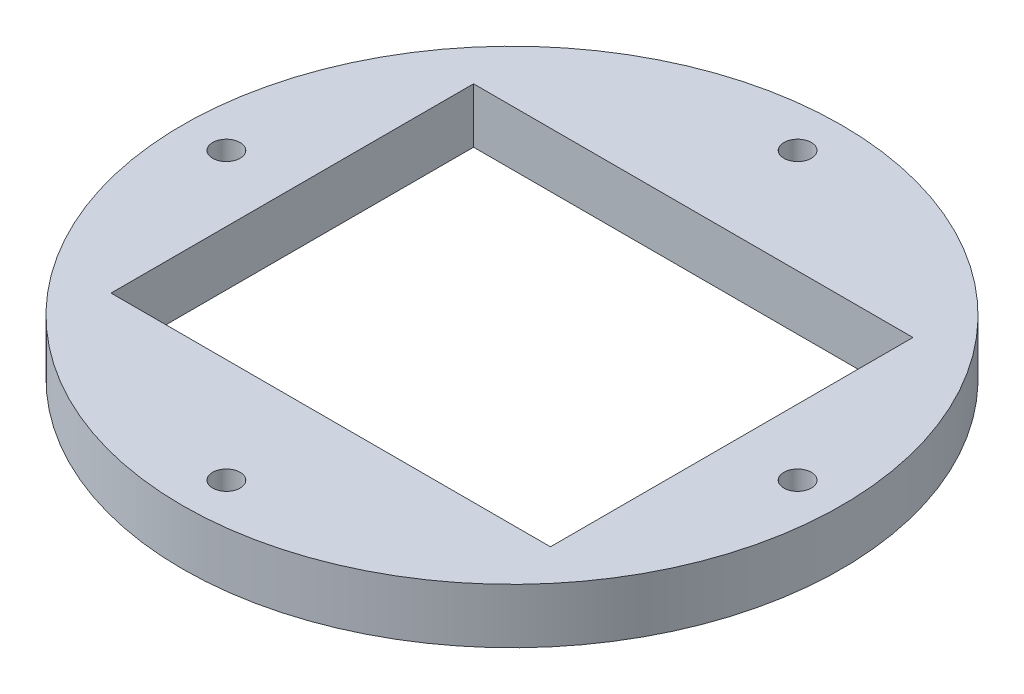
ISO-10303-21;
HEADER;
FILE_DESCRIPTION(('STEP AP214'),'2;1');
FILE_NAME('part.step','',(''),(''),'','','');
FILE_SCHEMA(('AUTOMOTIVE_DESIGN { 1 0 10303 214 1 1 1 1 }'));
ENDSEC;
DATA;
#1=APPLICATION_CONTEXT('core data for automotive mechanical design processes');
#2=APPLICATION_PROTOCOL_DEFINITION('international standard','automotive_design',2000,#1);
#3=PRODUCT_CONTEXT('',#1,'mechanical');
#4=PRODUCT('Part','Part','',(#3));
#5=PRODUCT_RELATED_PRODUCT_CATEGORY('part','',(#4));
#6=PRODUCT_DEFINITION_FORMATION('','',#4);
#7=PRODUCT_DEFINITION_CONTEXT('part definition',#1,'design');
#8=PRODUCT_DEFINITION('design','',#6,#7);
#9=PRODUCT_DEFINITION_SHAPE('','',#8);
#10=(LENGTH_UNIT() NAMED_UNIT(*) SI_UNIT(.MILLI.,.METRE.));
#11=(NAMED_UNIT(*) PLANE_ANGLE_UNIT() SI_UNIT($,.RADIAN.));
#12=(NAMED_UNIT(*) SI_UNIT($,.STERADIAN.) SOLID_ANGLE_UNIT());
#13=UNCERTAINTY_MEASURE_WITH_UNIT(LENGTH_MEASURE(1.E-05),#10,'distance_accuracy_value','');
#14=(GEOMETRIC_REPRESENTATION_CONTEXT(3) GLOBAL_UNCERTAINTY_ASSIGNED_CONTEXT((#13)) GLOBAL_UNIT_ASSIGNED_CONTEXT((#10,
#11,#12)) REPRESENTATION_CONTEXT('',''));
#15=CARTESIAN_POINT('',(0.,0.,0.));
#16=DIRECTION('',(0.,0.,1.));
#17=DIRECTION('',(1.,0.,0.));
#18=AXIS2_PLACEMENT_3D('',#15,#16,#17);
#19=CARTESIAN_POINT('',(0.,6.35,0.));
#20=DIRECTION('',(0.,1.,0.));
#21=DIRECTION('',(0.,0.,1.));
#22=AXIS2_PLACEMENT_3D('',#19,#20,#21);
#23=PLANE('',#22);
#24=CARTESIAN_POINT('',(0.,6.35,33.02));
#25=DIRECTION('',(0.,1.,0.));
#26=DIRECTION('',(0.,0.,1.));
#27=AXIS2_PLACEMENT_3D('',#24,#25,#26);
#28=CIRCLE('',#27,1.5875);
#29=CARTESIAN_POINT('',(0.,6.35,34.6075));
#30=VERTEX_POINT('',#29);
#31=EDGE_CURVE('E141',#30,#30,#28,.T.);
#32=ORIENTED_EDGE('',*,*,#31,.F.);
#33=EDGE_LOOP('',(#32));
#34=FACE_BOUND('',#33,.T.);
#35=DIRECTION('',(-1.,0.,0.));
#36=VECTOR('',#35,1.);
#37=CARTESIAN_POINT('',(-25.4,6.35,-20.955));
#38=LINE('',#37,#36);
#39=CARTESIAN_POINT('',(25.4,6.35,-20.955));
#40=VERTEX_POINT('',#39);
#41=CARTESIAN_POINT('',(-25.4,6.35,-20.955));
#42=VERTEX_POINT('',#41);
#43=EDGE_CURVE('E82',#40,#42,#38,.T.);
#44=ORIENTED_EDGE('',*,*,#43,.F.);
#45=DIRECTION('',(0.,0.,-1.));
#46=VECTOR('',#45,1.);
#47=CARTESIAN_POINT('',(25.4,6.35,20.955));
#48=LINE('',#47,#46);
#49=CARTESIAN_POINT('',(25.4,6.35,20.955));
#50=VERTEX_POINT('',#49);
#51=EDGE_CURVE('E74',#50,#40,#48,.T.);
#52=ORIENTED_EDGE('',*,*,#51,.F.);
#53=DIRECTION('',(1.,0.,0.));
#54=VECTOR('',#53,1.);
#55=CARTESIAN_POINT('',(-25.4,6.35,20.955));
#56=LINE('',#55,#54);
#57=CARTESIAN_POINT('',(-25.4,6.35,20.955));
#58=VERTEX_POINT('',#57);
#59=EDGE_CURVE('E97',#58,#50,#56,.T.);
#60=ORIENTED_EDGE('',*,*,#59,.F.);
#61=DIRECTION('',(0.,0.,1.));
#62=VECTOR('',#61,1.);
#63=CARTESIAN_POINT('',(-25.4,6.35,20.955));
#64=LINE('',#63,#62);
#65=EDGE_CURVE('E95',#42,#58,#64,.T.);
#66=ORIENTED_EDGE('',*,*,#65,.F.);
#67=EDGE_LOOP('',(#44,#52,#60,#66));
#68=FACE_BOUND('',#67,.T.);
#69=CARTESIAN_POINT('',(0.,6.35,0.));
#70=DIRECTION('',(0.,1.,0.));
#71=DIRECTION('',(0.,0.,1.));
#72=AXIS2_PLACEMENT_3D('',#69,#70,#71);
#73=CIRCLE('',#72,38.1);
#74=CARTESIAN_POINT('',(0.,6.35,38.1));
#75=VERTEX_POINT('',#74);
#76=EDGE_CURVE('E11',#75,#75,#73,.T.);
#77=ORIENTED_EDGE('',*,*,#76,.T.);
#78=EDGE_LOOP('',(#77));
#79=FACE_BOUND('',#78,.T.);
#80=CARTESIAN_POINT('',(0.,6.35,-33.02));
#81=DIRECTION('',(0.,1.,0.));
#82=DIRECTION('',(0.,0.,1.));
#83=AXIS2_PLACEMENT_3D('',#80,#81,#82);
#84=CIRCLE('',#83,1.5875);
#85=CARTESIAN_POINT('',(0.,6.35,-31.4325));
#86=VERTEX_POINT('',#85);
#87=EDGE_CURVE('E113',#86,#86,#84,.T.);
#88=ORIENTED_EDGE('',*,*,#87,.F.);
#89=EDGE_LOOP('',(#88));
#90=FACE_BOUND('',#89,.T.);
#91=CARTESIAN_POINT('',(33.02,6.35,0.));
#92=DIRECTION('',(0.,1.,0.));
#93=DIRECTION('',(0.,0.,1.));
#94=AXIS2_PLACEMENT_3D('',#91,#92,#93);
#95=CIRCLE('',#94,1.5875);
#96=CARTESIAN_POINT('',(33.02,6.35,1.5875));
#97=VERTEX_POINT('',#96);
#98=EDGE_CURVE('E103',#97,#97,#95,.T.);
#99=ORIENTED_EDGE('',*,*,#98,.F.);
#100=EDGE_LOOP('',(#99));
#101=FACE_BOUND('',#100,.T.);
#102=CARTESIAN_POINT('',(-33.02,6.35,0.));
#103=DIRECTION('',(0.,1.,0.));
#104=DIRECTION('',(0.,0.,1.));
#105=AXIS2_PLACEMENT_3D('',#102,#103,#104);
#106=CIRCLE('',#105,1.5875);
#107=CARTESIAN_POINT('',(-33.02,6.35,1.58750000000001));
#108=VERTEX_POINT('',#107);
#109=EDGE_CURVE('E148',#108,#108,#106,.T.);
#110=ORIENTED_EDGE('',*,*,#109,.F.);
#111=EDGE_LOOP('',(#110));
#112=FACE_BOUND('',#111,.T.);
#113=ADVANCED_FACE('F33',(#34,#68,#79,#90,#101,#112),#23,.T.);
#114=CARTESIAN_POINT('',(0.,0.,0.));
#115=DIRECTION('',(0.,1.,0.));
#116=DIRECTION('',(0.,0.,1.));
#117=AXIS2_PLACEMENT_3D('',#114,#115,#116);
#118=PLANE('',#117);
#119=CARTESIAN_POINT('',(0.,0.,33.02));
#120=DIRECTION('',(0.,1.,0.));
#121=DIRECTION('',(0.,0.,1.));
#122=AXIS2_PLACEMENT_3D('',#119,#120,#121);
#123=CIRCLE('',#122,1.5875);
#124=CARTESIAN_POINT('',(0.,0.,34.6075));
#125=VERTEX_POINT('',#124);
#126=EDGE_CURVE('E144',#125,#125,#123,.T.);
#127=ORIENTED_EDGE('',*,*,#126,.T.);
#128=EDGE_LOOP('',(#127));
#129=FACE_BOUND('',#128,.T.);
#130=DIRECTION('',(0.,0.,-1.));
#131=VECTOR('',#130,1.);
#132=CARTESIAN_POINT('',(25.4,0.,20.955));
#133=LINE('',#132,#131);
#134=CARTESIAN_POINT('',(25.4,0.,20.955));
#135=VERTEX_POINT('',#134);
#136=CARTESIAN_POINT('',(25.4,0.,-20.955));
#137=VERTEX_POINT('',#136);
#138=EDGE_CURVE('E56',#135,#137,#133,.T.);
#139=ORIENTED_EDGE('',*,*,#138,.T.);
#140=DIRECTION('',(-1.,0.,0.));
#141=VECTOR('',#140,1.);
#142=CARTESIAN_POINT('',(-25.4,0.,-20.955));
#143=LINE('',#142,#141);
#144=CARTESIAN_POINT('',(-25.4,0.,-20.955));
#145=VERTEX_POINT('',#144);
#146=EDGE_CURVE('E89',#137,#145,#143,.T.);
#147=ORIENTED_EDGE('',*,*,#146,.T.);
#148=DIRECTION('',(0.,0.,1.));
#149=VECTOR('',#148,1.);
#150=CARTESIAN_POINT('',(-25.4,0.,20.955));
#151=LINE('',#150,#149);
#152=CARTESIAN_POINT('',(-25.4,0.,20.955));
#153=VERTEX_POINT('',#152);
#154=EDGE_CURVE('E105',#145,#153,#151,.T.);
#155=ORIENTED_EDGE('',*,*,#154,.T.);
#156=DIRECTION('',(1.,0.,0.));
#157=VECTOR('',#156,1.);
#158=CARTESIAN_POINT('',(-25.4,0.,20.955));
#159=LINE('',#158,#157);
#160=EDGE_CURVE('E83',#153,#135,#159,.T.);
#161=ORIENTED_EDGE('',*,*,#160,.T.);
#162=EDGE_LOOP('',(#139,#147,#155,#161));
#163=FACE_BOUND('',#162,.T.);
#164=CARTESIAN_POINT('',(0.,0.,0.));
#165=DIRECTION('',(0.,1.,0.));
#166=DIRECTION('',(0.,0.,1.));
#167=AXIS2_PLACEMENT_3D('',#164,#165,#166);
#168=CIRCLE('',#167,38.1);
#169=CARTESIAN_POINT('',(0.,0.,38.1));
#170=VERTEX_POINT('',#169);
#171=EDGE_CURVE('E37',#170,#170,#168,.T.);
#172=ORIENTED_EDGE('',*,*,#171,.F.);
#173=EDGE_LOOP('',(#172));
#174=FACE_BOUND('',#173,.T.);
#175=CARTESIAN_POINT('',(0.,0.,-33.02));
#176=DIRECTION('',(0.,1.,0.));
#177=DIRECTION('',(0.,0.,1.));
#178=AXIS2_PLACEMENT_3D('',#175,#176,#177);
#179=CIRCLE('',#178,1.5875);
#180=CARTESIAN_POINT('',(0.,0.,-31.4325));
#181=VERTEX_POINT('',#180);
#182=EDGE_CURVE('E90',#181,#181,#179,.T.);
#183=ORIENTED_EDGE('',*,*,#182,.T.);
#184=EDGE_LOOP('',(#183));
#185=FACE_BOUND('',#184,.T.);
#186=CARTESIAN_POINT('',(33.02,0.,0.));
#187=DIRECTION('',(0.,1.,0.));
#188=DIRECTION('',(0.,0.,1.));
#189=AXIS2_PLACEMENT_3D('',#186,#187,#188);
#190=CIRCLE('',#189,1.5875);
#191=CARTESIAN_POINT('',(33.02,0.,1.5875));
#192=VERTEX_POINT('',#191);
#193=EDGE_CURVE('E143',#192,#192,#190,.T.);
#194=ORIENTED_EDGE('',*,*,#193,.T.);
#195=EDGE_LOOP('',(#194));
#196=FACE_BOUND('',#195,.T.);
#197=CARTESIAN_POINT('',(-33.02,0.,0.));
#198=DIRECTION('',(0.,1.,0.));
#199=DIRECTION('',(0.,0.,1.));
#200=AXIS2_PLACEMENT_3D('',#197,#198,#199);
#201=CIRCLE('',#200,1.5875);
#202=CARTESIAN_POINT('',(-33.02,0.,1.58750000000001));
#203=VERTEX_POINT('',#202);
#204=EDGE_CURVE('E151',#203,#203,#201,.T.);
#205=ORIENTED_EDGE('',*,*,#204,.T.);
#206=EDGE_LOOP('',(#205));
#207=FACE_BOUND('',#206,.T.);
#208=ADVANCED_FACE('F119',(#129,#163,#174,#185,#196,#207),#118,.F.);
#209=CARTESIAN_POINT('',(0.,6.35,0.));
#210=DIRECTION('',(0.,-1.,0.));
#211=DIRECTION('',(0.,0.,-1.));
#212=AXIS2_PLACEMENT_3D('',#209,#210,#211);
#213=CYLINDRICAL_SURFACE('',#212,38.1);
#214=ORIENTED_EDGE('',*,*,#76,.F.);
#215=EDGE_LOOP('',(#214));
#216=FACE_BOUND('',#215,.T.);
#217=ORIENTED_EDGE('',*,*,#171,.T.);
#218=EDGE_LOOP('',(#217));
#219=FACE_BOUND('',#218,.T.);
#220=ADVANCED_FACE('F35',(#216,#219),#213,.T.);
#221=CARTESIAN_POINT('',(0.,6.35,-33.02));
#222=DIRECTION('',(0.,-1.,0.));
#223=DIRECTION('',(0.,0.,-1.));
#224=AXIS2_PLACEMENT_3D('',#221,#222,#223);
#225=CYLINDRICAL_SURFACE('',#224,1.5875);
#226=ORIENTED_EDGE('',*,*,#87,.T.);
#227=EDGE_LOOP('',(#226));
#228=FACE_BOUND('',#227,.T.);
#229=ORIENTED_EDGE('',*,*,#182,.F.);
#230=EDGE_LOOP('',(#229));
#231=FACE_BOUND('',#230,.T.);
#232=ADVANCED_FACE('F122',(#228,#231),#225,.F.);
#233=CARTESIAN_POINT('',(25.4,6.35,20.955));
#234=DIRECTION('',(-1.,0.,0.));
#235=DIRECTION('',(0.,0.,1.));
#236=AXIS2_PLACEMENT_3D('',#233,#234,#235);
#237=PLANE('',#236);
#238=ORIENTED_EDGE('',*,*,#138,.F.);
#239=DIRECTION('',(0.,-1.,0.));
#240=VECTOR('',#239,1.);
#241=CARTESIAN_POINT('',(25.4,6.35,20.955));
#242=LINE('',#241,#240);
#243=EDGE_CURVE('E78',#50,#135,#242,.T.);
#244=ORIENTED_EDGE('',*,*,#243,.F.);
#245=ORIENTED_EDGE('',*,*,#51,.T.);
#246=DIRECTION('',(0.,-1.,0.));
#247=VECTOR('',#246,1.);
#248=CARTESIAN_POINT('',(25.4,6.35,-20.955));
#249=LINE('',#248,#247);
#250=EDGE_CURVE('E77',#40,#137,#249,.T.);
#251=ORIENTED_EDGE('',*,*,#250,.T.);
#252=EDGE_LOOP('',(#238,#244,#245,#251));
#253=FACE_BOUND('',#252,.T.);
#254=ADVANCED_FACE('F76',(#253),#237,.T.);
#255=CARTESIAN_POINT('',(-25.4,6.35,-20.955));
#256=DIRECTION('',(0.,0.,1.));
#257=DIRECTION('',(1.,0.,0.));
#258=AXIS2_PLACEMENT_3D('',#255,#256,#257);
#259=PLANE('',#258);
#260=ORIENTED_EDGE('',*,*,#146,.F.);
#261=ORIENTED_EDGE('',*,*,#250,.F.);
#262=ORIENTED_EDGE('',*,*,#43,.T.);
#263=DIRECTION('',(0.,-1.,0.));
#264=VECTOR('',#263,1.);
#265=CARTESIAN_POINT('',(-25.4,6.35,-20.955));
#266=LINE('',#265,#264);
#267=EDGE_CURVE('E91',#42,#145,#266,.T.);
#268=ORIENTED_EDGE('',*,*,#267,.T.);
#269=EDGE_LOOP('',(#260,#261,#262,#268));
#270=FACE_BOUND('',#269,.T.);
#271=ADVANCED_FACE('F86',(#270),#259,.T.);
#272=CARTESIAN_POINT('',(-25.4,6.35,20.955));
#273=DIRECTION('',(1.,0.,0.));
#274=DIRECTION('',(0.,0.,-1.));
#275=AXIS2_PLACEMENT_3D('',#272,#273,#274);
#276=PLANE('',#275);
#277=ORIENTED_EDGE('',*,*,#154,.F.);
#278=ORIENTED_EDGE('',*,*,#267,.F.);
#279=ORIENTED_EDGE('',*,*,#65,.T.);
#280=DIRECTION('',(0.,-1.,0.));
#281=VECTOR('',#280,1.);
#282=CARTESIAN_POINT('',(-25.4,6.35,20.955));
#283=LINE('',#282,#281);
#284=EDGE_CURVE('E48',#58,#153,#283,.T.);
#285=ORIENTED_EDGE('',*,*,#284,.T.);
#286=EDGE_LOOP('',(#277,#278,#279,#285));
#287=FACE_BOUND('',#286,.T.);
#288=ADVANCED_FACE('F182',(#287),#276,.T.);
#289=CARTESIAN_POINT('',(-25.4,6.35,20.955));
#290=DIRECTION('',(0.,0.,-1.));
#291=DIRECTION('',(-1.,0.,0.));
#292=AXIS2_PLACEMENT_3D('',#289,#290,#291);
#293=PLANE('',#292);
#294=ORIENTED_EDGE('',*,*,#160,.F.);
#295=ORIENTED_EDGE('',*,*,#284,.F.);
#296=ORIENTED_EDGE('',*,*,#59,.T.);
#297=ORIENTED_EDGE('',*,*,#243,.T.);
#298=EDGE_LOOP('',(#294,#295,#296,#297));
#299=FACE_BOUND('',#298,.T.);
#300=ADVANCED_FACE('F179',(#299),#293,.T.);
#301=CARTESIAN_POINT('',(33.02,6.35,0.));
#302=DIRECTION('',(0.,-1.,0.));
#303=DIRECTION('',(0.,0.,-1.));
#304=AXIS2_PLACEMENT_3D('',#301,#302,#303);
#305=CYLINDRICAL_SURFACE('',#304,1.5875);
#306=ORIENTED_EDGE('',*,*,#98,.T.);
#307=EDGE_LOOP('',(#306));
#308=FACE_BOUND('',#307,.T.);
#309=ORIENTED_EDGE('',*,*,#193,.F.);
#310=EDGE_LOOP('',(#309));
#311=FACE_BOUND('',#310,.T.);
#312=ADVANCED_FACE('F157',(#308,#311),#305,.F.);
#313=CARTESIAN_POINT('',(0.,6.35,33.02));
#314=DIRECTION('',(0.,-1.,0.));
#315=DIRECTION('',(0.,0.,-1.));
#316=AXIS2_PLACEMENT_3D('',#313,#314,#315);
#317=CYLINDRICAL_SURFACE('',#316,1.5875);
#318=ORIENTED_EDGE('',*,*,#31,.T.);
#319=EDGE_LOOP('',(#318));
#320=FACE_BOUND('',#319,.T.);
#321=ORIENTED_EDGE('',*,*,#126,.F.);
#322=EDGE_LOOP('',(#321));
#323=FACE_BOUND('',#322,.T.);
#324=ADVANCED_FACE('F170',(#320,#323),#317,.F.);
#325=CARTESIAN_POINT('',(-33.02,6.35,0.));
#326=DIRECTION('',(0.,-1.,0.));
#327=DIRECTION('',(0.,0.,-1.));
#328=AXIS2_PLACEMENT_3D('',#325,#326,#327);
#329=CYLINDRICAL_SURFACE('',#328,1.5875);
#330=ORIENTED_EDGE('',*,*,#109,.T.);
#331=EDGE_LOOP('',(#330));
#332=FACE_BOUND('',#331,.T.);
#333=ORIENTED_EDGE('',*,*,#204,.F.);
#334=EDGE_LOOP('',(#333));
#335=FACE_BOUND('',#334,.T.);
#336=ADVANCED_FACE('F168',(#332,#335),#329,.F.);
#337=CLOSED_SHELL('',(#113,#208,#220,#232,#254,#271,#288,#300,#312,#324,#336));
#338=MANIFOLD_SOLID_BREP('B2',#337);
#339=ADVANCED_BREP_SHAPE_REPRESENTATION('',(#18,#338),#14);
#340=SHAPE_DEFINITION_REPRESENTATION(#9,#339);
ENDSEC;
END-ISO-10303-21;
